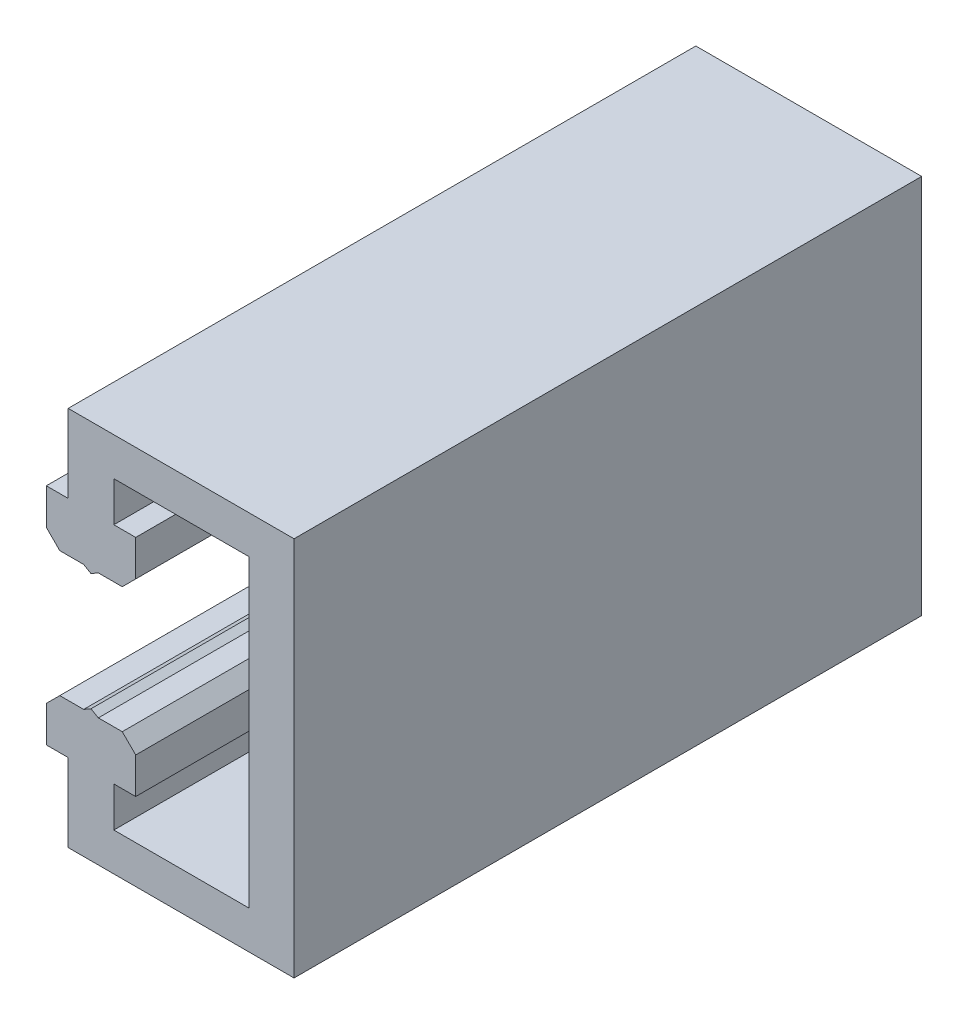
ISO-10303-21;
HEADER;
FILE_DESCRIPTION(('STEP AP214'),'2;1');
FILE_NAME('part.step','',(''),(''),'','','');
FILE_SCHEMA(('AUTOMOTIVE_DESIGN { 1 0 10303 214 1 1 1 1 }'));
ENDSEC;
DATA;
#1=APPLICATION_CONTEXT('core data for automotive mechanical design processes');
#2=APPLICATION_PROTOCOL_DEFINITION('international standard','automotive_design',2000,#1);
#3=PRODUCT_CONTEXT('',#1,'mechanical');
#4=PRODUCT('Part','Part','',(#3));
#5=PRODUCT_RELATED_PRODUCT_CATEGORY('part','',(#4));
#6=PRODUCT_DEFINITION_FORMATION('','',#4);
#7=PRODUCT_DEFINITION_CONTEXT('part definition',#1,'design');
#8=PRODUCT_DEFINITION('design','',#6,#7);
#9=PRODUCT_DEFINITION_SHAPE('','',#8);
#10=(LENGTH_UNIT() NAMED_UNIT(*) SI_UNIT(.MILLI.,.METRE.));
#11=(NAMED_UNIT(*) PLANE_ANGLE_UNIT() SI_UNIT($,.RADIAN.));
#12=(NAMED_UNIT(*) SI_UNIT($,.STERADIAN.) SOLID_ANGLE_UNIT());
#13=UNCERTAINTY_MEASURE_WITH_UNIT(LENGTH_MEASURE(1.E-05),#10,'distance_accuracy_value','');
#14=(GEOMETRIC_REPRESENTATION_CONTEXT(3) GLOBAL_UNCERTAINTY_ASSIGNED_CONTEXT((#13)) GLOBAL_UNIT_ASSIGNED_CONTEXT((#10,
#11,#12)) REPRESENTATION_CONTEXT('',''));
#15=CARTESIAN_POINT('',(0.,0.,0.));
#16=DIRECTION('',(0.,0.,1.));
#17=DIRECTION('',(1.,0.,0.));
#18=AXIS2_PLACEMENT_3D('',#15,#16,#17);
#19=CARTESIAN_POINT('',(1253.63302230835,549.842417240143,33.));
#20=DIRECTION('',(1.,0.,0.));
#21=DIRECTION('',(0.,0.,-1.));
#22=AXIS2_PLACEMENT_3D('',#19,#20,#21);
#23=PLANE('',#22);
#24=DIRECTION('',(0.,-1.,0.));
#25=VECTOR('',#24,1.);
#26=CARTESIAN_POINT('',(1253.63302230835,549.842417240143,0.));
#27=LINE('',#26,#25);
#28=CARTESIAN_POINT('',(1253.63302230835,553.942382335663,0.));
#29=VERTEX_POINT('',#28);
#30=CARTESIAN_POINT('',(1253.63302230835,549.842417240143,0.));
#31=VERTEX_POINT('',#30);
#32=EDGE_CURVE('E261',#29,#31,#27,.T.);
#33=ORIENTED_EDGE('',*,*,#32,.T.);
#34=DIRECTION('',(0.,0.,-1.));
#35=VECTOR('',#34,1.);
#36=CARTESIAN_POINT('',(1253.63302230835,549.842417240143,33.));
#37=LINE('',#36,#35);
#38=CARTESIAN_POINT('',(1253.63302230835,549.842417240143,33.));
#39=VERTEX_POINT('',#38);
#40=EDGE_CURVE('E11',#39,#31,#37,.T.);
#41=ORIENTED_EDGE('',*,*,#40,.F.);
#42=DIRECTION('',(0.,-1.,0.));
#43=VECTOR('',#42,1.);
#44=CARTESIAN_POINT('',(1253.63302230835,549.842417240143,33.));
#45=LINE('',#44,#43);
#46=CARTESIAN_POINT('',(1253.63302230835,553.942382335663,33.));
#47=VERTEX_POINT('',#46);
#48=EDGE_CURVE('E319',#47,#39,#45,.T.);
#49=ORIENTED_EDGE('',*,*,#48,.F.);
#50=DIRECTION('',(0.,0.,-1.));
#51=VECTOR('',#50,1.);
#52=CARTESIAN_POINT('',(1253.63302230835,553.942382335663,33.));
#53=LINE('',#52,#51);
#54=EDGE_CURVE('E257',#47,#29,#53,.T.);
#55=ORIENTED_EDGE('',*,*,#54,.T.);
#56=EDGE_LOOP('',(#33,#41,#49,#55));
#57=FACE_BOUND('',#56,.T.);
#58=ADVANCED_FACE('F33',(#57),#23,.F.);
#59=CARTESIAN_POINT('',(1252.48301029205,549.842417240143,33.));
#60=DIRECTION('',(0.,-1.,0.));
#61=DIRECTION('',(0.,0.,-1.));
#62=AXIS2_PLACEMENT_3D('',#59,#60,#61);
#63=PLANE('',#62);
#64=DIRECTION('',(-1.,0.,0.));
#65=VECTOR('',#64,1.);
#66=CARTESIAN_POINT('',(1252.48301029205,549.842417240143,0.));
#67=LINE('',#66,#65);
#68=CARTESIAN_POINT('',(1252.48301029205,549.842417240143,0.));
#69=VERTEX_POINT('',#68);
#70=EDGE_CURVE('E264',#31,#69,#67,.T.);
#71=ORIENTED_EDGE('',*,*,#70,.T.);
#72=DIRECTION('',(0.,0.,-1.));
#73=VECTOR('',#72,1.);
#74=CARTESIAN_POINT('',(1252.48301029205,549.842417240143,33.));
#75=LINE('',#74,#73);
#76=CARTESIAN_POINT('',(1252.48301029205,549.842417240143,33.));
#77=VERTEX_POINT('',#76);
#78=EDGE_CURVE('E41',#77,#69,#75,.T.);
#79=ORIENTED_EDGE('',*,*,#78,.F.);
#80=DIRECTION('',(-1.,0.,0.));
#81=VECTOR('',#80,1.);
#82=CARTESIAN_POINT('',(1252.48301029205,549.842417240143,33.));
#83=LINE('',#82,#81);
#84=EDGE_CURVE('E158',#39,#77,#83,.T.);
#85=ORIENTED_EDGE('',*,*,#84,.F.);
#86=ORIENTED_EDGE('',*,*,#40,.T.);
#87=EDGE_LOOP('',(#71,#79,#85,#86));
#88=FACE_BOUND('',#87,.T.);
#89=ADVANCED_FACE('F487',(#88),#63,.F.);
#90=CARTESIAN_POINT('',(1252.48301029205,547.949492931366,33.));
#91=DIRECTION('',(1.,0.,0.));
#92=DIRECTION('',(0.,0.,-1.));
#93=AXIS2_PLACEMENT_3D('',#90,#91,#92);
#94=PLANE('',#93);
#95=DIRECTION('',(0.,-1.,0.));
#96=VECTOR('',#95,1.);
#97=CARTESIAN_POINT('',(1252.48301029205,547.949492931366,0.));
#98=LINE('',#97,#96);
#99=CARTESIAN_POINT('',(1252.48301029205,547.949492931366,0.));
#100=VERTEX_POINT('',#99);
#101=EDGE_CURVE('E266',#69,#100,#98,.T.);
#102=ORIENTED_EDGE('',*,*,#101,.T.);
#103=DIRECTION('',(0.,0.,-1.));
#104=VECTOR('',#103,1.);
#105=CARTESIAN_POINT('',(1252.48301029205,547.949492931366,33.));
#106=LINE('',#105,#104);
#107=CARTESIAN_POINT('',(1252.48301029205,547.949492931366,33.));
#108=VERTEX_POINT('',#107);
#109=EDGE_CURVE('E392',#108,#100,#106,.T.);
#110=ORIENTED_EDGE('',*,*,#109,.F.);
#111=DIRECTION('',(0.,-1.,0.));
#112=VECTOR('',#111,1.);
#113=CARTESIAN_POINT('',(1252.48301029205,547.949492931366,33.));
#114=LINE('',#113,#112);
#115=EDGE_CURVE('E400',#77,#108,#114,.T.);
#116=ORIENTED_EDGE('',*,*,#115,.F.);
#117=ORIENTED_EDGE('',*,*,#78,.T.);
#118=EDGE_LOOP('',(#102,#110,#116,#117));
#119=FACE_BOUND('',#118,.T.);
#120=ADVANCED_FACE('F398',(#119),#94,.F.);
#121=CARTESIAN_POINT('',(1253.19015979767,547.242403030396,33.));
#122=DIRECTION('',(0.707076978780788,0.707136582336279,0.));
#123=DIRECTION('',(-0.707136582336279,0.707076978780788,0.));
#124=AXIS2_PLACEMENT_3D('',#121,#122,#123);
#125=PLANE('',#124);
#126=DIRECTION('',(0.707136582336279,-0.707076978780788,0.));
#127=VECTOR('',#126,1.);
#128=CARTESIAN_POINT('',(1253.19015979767,547.242403030396,0.));
#129=LINE('',#128,#127);
#130=CARTESIAN_POINT('',(1253.19015979767,547.242403030396,0.));
#131=VERTEX_POINT('',#130);
#132=EDGE_CURVE('E268',#100,#131,#129,.T.);
#133=ORIENTED_EDGE('',*,*,#132,.T.);
#134=DIRECTION('',(0.,0.,-1.));
#135=VECTOR('',#134,1.);
#136=CARTESIAN_POINT('',(1253.19015979767,547.242403030396,33.));
#137=LINE('',#136,#135);
#138=CARTESIAN_POINT('',(1253.19015979767,547.242403030396,33.));
#139=VERTEX_POINT('',#138);
#140=EDGE_CURVE('E389',#139,#131,#137,.T.);
#141=ORIENTED_EDGE('',*,*,#140,.F.);
#142=DIRECTION('',(0.707136582336279,-0.707076978780788,0.));
#143=VECTOR('',#142,1.);
#144=CARTESIAN_POINT('',(1253.19015979767,547.242403030396,33.));
#145=LINE('',#144,#143);
#146=EDGE_CURVE('E418',#108,#139,#145,.T.);
#147=ORIENTED_EDGE('',*,*,#146,.F.);
#148=ORIENTED_EDGE('',*,*,#109,.T.);
#149=EDGE_LOOP('',(#133,#141,#147,#148));
#150=FACE_BOUND('',#149,.T.);
#151=ADVANCED_FACE('F409',(#150),#125,.F.);
#152=CARTESIAN_POINT('',(1254.44746017456,547.242403030396,33.));
#153=DIRECTION('',(0.,1.,0.));
#154=DIRECTION('',(0.,0.,1.));
#155=AXIS2_PLACEMENT_3D('',#152,#153,#154);
#156=PLANE('',#155);
#157=DIRECTION('',(1.,0.,0.));
#158=VECTOR('',#157,1.);
#159=CARTESIAN_POINT('',(1254.44746017456,547.242403030396,0.));
#160=LINE('',#159,#158);
#161=CARTESIAN_POINT('',(1254.44746017456,547.242403030396,0.));
#162=VERTEX_POINT('',#161);
#163=EDGE_CURVE('E270',#131,#162,#160,.T.);
#164=ORIENTED_EDGE('',*,*,#163,.T.);
#165=DIRECTION('',(0.,0.,-1.));
#166=VECTOR('',#165,1.);
#167=CARTESIAN_POINT('',(1254.44746017456,547.242403030396,33.));
#168=LINE('',#167,#166);
#169=CARTESIAN_POINT('',(1254.44746017456,547.242403030396,33.));
#170=VERTEX_POINT('',#169);
#171=EDGE_CURVE('E386',#170,#162,#168,.T.);
#172=ORIENTED_EDGE('',*,*,#171,.F.);
#173=DIRECTION('',(1.,0.,0.));
#174=VECTOR('',#173,1.);
#175=CARTESIAN_POINT('',(1254.44746017456,547.242403030396,33.));
#176=LINE('',#175,#174);
#177=EDGE_CURVE('E415',#139,#170,#176,.T.);
#178=ORIENTED_EDGE('',*,*,#177,.F.);
#179=ORIENTED_EDGE('',*,*,#140,.T.);
#180=EDGE_LOOP('',(#164,#172,#178,#179));
#181=FACE_BOUND('',#180,.T.);
#182=ADVANCED_FACE('F413',(#181),#156,.F.);
#183=CARTESIAN_POINT('',(1254.83310222626,547.019720077515,33.));
#184=DIRECTION('',(0.500054584563358,0.865993887078406,0.));
#185=DIRECTION('',(-0.865993887078406,0.500054584563358,0.));
#186=AXIS2_PLACEMENT_3D('',#183,#184,#185);
#187=PLANE('',#186);
#188=DIRECTION('',(0.865993887078406,-0.500054584563358,0.));
#189=VECTOR('',#188,1.);
#190=CARTESIAN_POINT('',(1254.83310222626,547.019720077515,0.));
#191=LINE('',#190,#189);
#192=CARTESIAN_POINT('',(1254.83310222626,547.019720077515,0.));
#193=VERTEX_POINT('',#192);
#194=EDGE_CURVE('E272',#162,#193,#191,.T.);
#195=ORIENTED_EDGE('',*,*,#194,.T.);
#196=DIRECTION('',(0.,0.,-1.));
#197=VECTOR('',#196,1.);
#198=CARTESIAN_POINT('',(1254.83310222626,547.019720077515,33.));
#199=LINE('',#198,#197);
#200=CARTESIAN_POINT('',(1254.83310222626,547.019720077515,33.));
#201=VERTEX_POINT('',#200);
#202=EDGE_CURVE('E383',#201,#193,#199,.T.);
#203=ORIENTED_EDGE('',*,*,#202,.F.);
#204=DIRECTION('',(0.865993887078406,-0.500054584563358,0.));
#205=VECTOR('',#204,1.);
#206=CARTESIAN_POINT('',(1254.83310222626,547.019720077515,33.));
#207=LINE('',#206,#205);
#208=EDGE_CURVE('E417',#170,#201,#207,.T.);
#209=ORIENTED_EDGE('',*,*,#208,.F.);
#210=ORIENTED_EDGE('',*,*,#171,.T.);
#211=EDGE_LOOP('',(#195,#203,#209,#210));
#212=FACE_BOUND('',#211,.T.);
#213=ADVANCED_FACE('F500',(#212),#187,.F.);
#214=CARTESIAN_POINT('',(1255.21874427795,547.242403030396,33.));
#215=DIRECTION('',(-0.500054584563358,0.865993887078406,0.));
#216=DIRECTION('',(-0.865993887078406,-0.500054584563358,0.));
#217=AXIS2_PLACEMENT_3D('',#214,#215,#216);
#218=PLANE('',#217);
#219=DIRECTION('',(0.865993887078406,0.500054584563358,0.));
#220=VECTOR('',#219,1.);
#221=CARTESIAN_POINT('',(1255.21874427795,547.242403030396,0.));
#222=LINE('',#221,#220);
#223=CARTESIAN_POINT('',(1255.21874427795,547.242403030396,0.));
#224=VERTEX_POINT('',#223);
#225=EDGE_CURVE('E274',#193,#224,#222,.T.);
#226=ORIENTED_EDGE('',*,*,#225,.T.);
#227=DIRECTION('',(0.,0.,-1.));
#228=VECTOR('',#227,1.);
#229=CARTESIAN_POINT('',(1255.21874427795,547.242403030396,33.));
#230=LINE('',#229,#228);
#231=CARTESIAN_POINT('',(1255.21874427795,547.242403030396,33.));
#232=VERTEX_POINT('',#231);
#233=EDGE_CURVE('E380',#232,#224,#230,.T.);
#234=ORIENTED_EDGE('',*,*,#233,.F.);
#235=DIRECTION('',(0.865993887078406,0.500054584563358,0.));
#236=VECTOR('',#235,1.);
#237=CARTESIAN_POINT('',(1255.21874427795,547.242403030396,33.));
#238=LINE('',#237,#236);
#239=EDGE_CURVE('E420',#201,#232,#238,.T.);
#240=ORIENTED_EDGE('',*,*,#239,.F.);
#241=ORIENTED_EDGE('',*,*,#202,.T.);
#242=EDGE_LOOP('',(#226,#234,#240,#241));
#243=FACE_BOUND('',#242,.T.);
#244=ADVANCED_FACE('F503',(#243),#218,.F.);
#245=CARTESIAN_POINT('',(1256.47592544556,547.242403030396,33.));
#246=DIRECTION('',(0.,1.,0.));
#247=DIRECTION('',(0.,0.,1.));
#248=AXIS2_PLACEMENT_3D('',#245,#246,#247);
#249=PLANE('',#248);
#250=DIRECTION('',(1.,0.,0.));
#251=VECTOR('',#250,1.);
#252=CARTESIAN_POINT('',(1256.47592544556,547.242403030396,0.));
#253=LINE('',#252,#251);
#254=CARTESIAN_POINT('',(1256.47592544556,547.242403030396,0.));
#255=VERTEX_POINT('',#254);
#256=EDGE_CURVE('E276',#224,#255,#253,.T.);
#257=ORIENTED_EDGE('',*,*,#256,.T.);
#258=DIRECTION('',(0.,0.,-1.));
#259=VECTOR('',#258,1.);
#260=CARTESIAN_POINT('',(1256.47592544556,547.242403030396,33.));
#261=LINE('',#260,#259);
#262=CARTESIAN_POINT('',(1256.47592544556,547.242403030396,33.));
#263=VERTEX_POINT('',#262);
#264=EDGE_CURVE('E377',#263,#255,#261,.T.);
#265=ORIENTED_EDGE('',*,*,#264,.F.);
#266=DIRECTION('',(1.,0.,0.));
#267=VECTOR('',#266,1.);
#268=CARTESIAN_POINT('',(1256.47592544556,547.242403030396,33.));
#269=LINE('',#268,#267);
#270=EDGE_CURVE('E426',#232,#263,#269,.T.);
#271=ORIENTED_EDGE('',*,*,#270,.F.);
#272=ORIENTED_EDGE('',*,*,#233,.T.);
#273=EDGE_LOOP('',(#257,#265,#271,#272));
#274=FACE_BOUND('',#273,.T.);
#275=ADVANCED_FACE('F507',(#274),#249,.F.);
#276=CARTESIAN_POINT('',(1257.18307495117,547.949492931366,33.));
#277=DIRECTION('',(-0.707076978780788,0.707136582336279,0.));
#278=DIRECTION('',(-0.707136582336279,-0.707076978780788,0.));
#279=AXIS2_PLACEMENT_3D('',#276,#277,#278);
#280=PLANE('',#279);
#281=DIRECTION('',(0.707136582336279,0.707076978780788,0.));
#282=VECTOR('',#281,1.);
#283=CARTESIAN_POINT('',(1257.18307495117,547.949492931366,0.));
#284=LINE('',#283,#282);
#285=CARTESIAN_POINT('',(1257.18307495117,547.949492931366,0.));
#286=VERTEX_POINT('',#285);
#287=EDGE_CURVE('E278',#255,#286,#284,.T.);
#288=ORIENTED_EDGE('',*,*,#287,.T.);
#289=DIRECTION('',(0.,0.,-1.));
#290=VECTOR('',#289,1.);
#291=CARTESIAN_POINT('',(1257.18307495117,547.949492931366,33.));
#292=LINE('',#291,#290);
#293=CARTESIAN_POINT('',(1257.18307495117,547.949492931366,33.));
#294=VERTEX_POINT('',#293);
#295=EDGE_CURVE('E374',#294,#286,#292,.T.);
#296=ORIENTED_EDGE('',*,*,#295,.F.);
#297=DIRECTION('',(0.707136582336279,0.707076978780788,0.));
#298=VECTOR('',#297,1.);
#299=CARTESIAN_POINT('',(1257.18307495117,547.949492931366,33.));
#300=LINE('',#299,#298);
#301=EDGE_CURVE('E428',#263,#294,#300,.T.);
#302=ORIENTED_EDGE('',*,*,#301,.F.);
#303=ORIENTED_EDGE('',*,*,#264,.T.);
#304=EDGE_LOOP('',(#288,#296,#302,#303));
#305=FACE_BOUND('',#304,.T.);
#306=ADVANCED_FACE('F511',(#305),#280,.F.);
#307=CARTESIAN_POINT('',(1257.18307495117,549.842417240143,33.));
#308=DIRECTION('',(-1.,0.,0.));
#309=DIRECTION('',(0.,0.,1.));
#310=AXIS2_PLACEMENT_3D('',#307,#308,#309);
#311=PLANE('',#310);
#312=DIRECTION('',(0.,1.,0.));
#313=VECTOR('',#312,1.);
#314=CARTESIAN_POINT('',(1257.18307495117,549.842417240143,0.));
#315=LINE('',#314,#313);
#316=CARTESIAN_POINT('',(1257.18307495117,549.842417240143,0.));
#317=VERTEX_POINT('',#316);
#318=EDGE_CURVE('E280',#286,#317,#315,.T.);
#319=ORIENTED_EDGE('',*,*,#318,.T.);
#320=DIRECTION('',(0.,0.,-1.));
#321=VECTOR('',#320,1.);
#322=CARTESIAN_POINT('',(1257.18307495117,549.842417240143,33.));
#323=LINE('',#322,#321);
#324=CARTESIAN_POINT('',(1257.18307495117,549.842417240143,33.));
#325=VERTEX_POINT('',#324);
#326=EDGE_CURVE('E371',#325,#317,#323,.T.);
#327=ORIENTED_EDGE('',*,*,#326,.F.);
#328=DIRECTION('',(0.,1.,0.));
#329=VECTOR('',#328,1.);
#330=CARTESIAN_POINT('',(1257.18307495117,549.842417240143,33.));
#331=LINE('',#330,#329);
#332=EDGE_CURVE('E430',#294,#325,#331,.T.);
#333=ORIENTED_EDGE('',*,*,#332,.F.);
#334=ORIENTED_EDGE('',*,*,#295,.T.);
#335=EDGE_LOOP('',(#319,#327,#333,#334));
#336=FACE_BOUND('',#335,.T.);
#337=ADVANCED_FACE('F515',(#336),#311,.F.);
#338=CARTESIAN_POINT('',(1256.03306293488,549.842417240143,33.));
#339=DIRECTION('',(0.,-1.,0.));
#340=DIRECTION('',(0.,0.,-1.));
#341=AXIS2_PLACEMENT_3D('',#338,#339,#340);
#342=PLANE('',#341);
#343=DIRECTION('',(-1.,0.,0.));
#344=VECTOR('',#343,1.);
#345=CARTESIAN_POINT('',(1256.03306293488,549.842417240143,0.));
#346=LINE('',#345,#344);
#347=CARTESIAN_POINT('',(1256.03306293488,549.842417240143,0.));
#348=VERTEX_POINT('',#347);
#349=EDGE_CURVE('E282',#317,#348,#346,.T.);
#350=ORIENTED_EDGE('',*,*,#349,.T.);
#351=DIRECTION('',(0.,0.,-1.));
#352=VECTOR('',#351,1.);
#353=CARTESIAN_POINT('',(1256.03306293488,549.842417240143,33.));
#354=LINE('',#353,#352);
#355=CARTESIAN_POINT('',(1256.03306293488,549.842417240143,33.));
#356=VERTEX_POINT('',#355);
#357=EDGE_CURVE('E368',#356,#348,#354,.T.);
#358=ORIENTED_EDGE('',*,*,#357,.F.);
#359=DIRECTION('',(-1.,0.,0.));
#360=VECTOR('',#359,1.);
#361=CARTESIAN_POINT('',(1256.03306293488,549.842417240143,33.));
#362=LINE('',#361,#360);
#363=EDGE_CURVE('E432',#325,#356,#362,.T.);
#364=ORIENTED_EDGE('',*,*,#363,.F.);
#365=ORIENTED_EDGE('',*,*,#326,.T.);
#366=EDGE_LOOP('',(#350,#358,#364,#365));
#367=FACE_BOUND('',#366,.T.);
#368=ADVANCED_FACE('F519',(#367),#342,.F.);
#369=CARTESIAN_POINT('',(1256.03306293488,551.942408084869,33.));
#370=DIRECTION('',(-1.,0.,0.));
#371=DIRECTION('',(0.,0.,1.));
#372=AXIS2_PLACEMENT_3D('',#369,#370,#371);
#373=PLANE('',#372);
#374=DIRECTION('',(0.,1.,0.));
#375=VECTOR('',#374,1.);
#376=CARTESIAN_POINT('',(1256.03306293488,551.942408084869,0.));
#377=LINE('',#376,#375);
#378=CARTESIAN_POINT('',(1256.03306293488,551.942408084869,0.));
#379=VERTEX_POINT('',#378);
#380=EDGE_CURVE('E284',#348,#379,#377,.T.);
#381=ORIENTED_EDGE('',*,*,#380,.T.);
#382=DIRECTION('',(0.,0.,-1.));
#383=VECTOR('',#382,1.);
#384=CARTESIAN_POINT('',(1256.03306293488,551.942408084869,33.));
#385=LINE('',#384,#383);
#386=CARTESIAN_POINT('',(1256.03306293488,551.942408084869,33.));
#387=VERTEX_POINT('',#386);
#388=EDGE_CURVE('E365',#387,#379,#385,.T.);
#389=ORIENTED_EDGE('',*,*,#388,.F.);
#390=DIRECTION('',(0.,1.,0.));
#391=VECTOR('',#390,1.);
#392=CARTESIAN_POINT('',(1256.03306293488,551.942408084869,33.));
#393=LINE('',#392,#391);
#394=EDGE_CURVE('E434',#356,#387,#393,.T.);
#395=ORIENTED_EDGE('',*,*,#394,.F.);
#396=ORIENTED_EDGE('',*,*,#357,.T.);
#397=EDGE_LOOP('',(#381,#389,#395,#396));
#398=FACE_BOUND('',#397,.T.);
#399=ADVANCED_FACE('F523',(#398),#373,.F.);
#400=CARTESIAN_POINT('',(1263.12685012817,551.942408084869,33.));
#401=DIRECTION('',(0.,1.,0.));
#402=DIRECTION('',(0.,0.,1.));
#403=AXIS2_PLACEMENT_3D('',#400,#401,#402);
#404=PLANE('',#403);
#405=DIRECTION('',(1.,0.,0.));
#406=VECTOR('',#405,1.);
#407=CARTESIAN_POINT('',(1263.12685012817,551.942408084869,0.));
#408=LINE('',#407,#406);
#409=CARTESIAN_POINT('',(1263.12685012817,551.942408084869,0.));
#410=VERTEX_POINT('',#409);
#411=EDGE_CURVE('E286',#379,#410,#408,.T.);
#412=ORIENTED_EDGE('',*,*,#411,.T.);
#413=DIRECTION('',(0.,0.,-1.));
#414=VECTOR('',#413,1.);
#415=CARTESIAN_POINT('',(1263.12685012817,551.942408084869,33.));
#416=LINE('',#415,#414);
#417=CARTESIAN_POINT('',(1263.12685012817,551.942408084869,33.));
#418=VERTEX_POINT('',#417);
#419=EDGE_CURVE('E362',#418,#410,#416,.T.);
#420=ORIENTED_EDGE('',*,*,#419,.F.);
#421=DIRECTION('',(1.,0.,0.));
#422=VECTOR('',#421,1.);
#423=CARTESIAN_POINT('',(1263.12685012817,551.942408084869,33.));
#424=LINE('',#423,#422);
#425=EDGE_CURVE('E436',#387,#418,#424,.T.);
#426=ORIENTED_EDGE('',*,*,#425,.F.);
#427=ORIENTED_EDGE('',*,*,#388,.T.);
#428=EDGE_LOOP('',(#412,#420,#426,#427));
#429=FACE_BOUND('',#428,.T.);
#430=ADVANCED_FACE('F527',(#429),#404,.F.);
#431=CARTESIAN_POINT('',(1263.12685012817,535.942375659943,33.));
#432=DIRECTION('',(1.,0.,0.));
#433=DIRECTION('',(0.,0.,-1.));
#434=AXIS2_PLACEMENT_3D('',#431,#432,#433);
#435=PLANE('',#434);
#436=DIRECTION('',(0.,-1.,0.));
#437=VECTOR('',#436,1.);
#438=CARTESIAN_POINT('',(1263.12685012817,535.942375659943,0.));
#439=LINE('',#438,#437);
#440=CARTESIAN_POINT('',(1263.12685012817,535.942375659943,0.));
#441=VERTEX_POINT('',#440);
#442=EDGE_CURVE('E288',#410,#441,#439,.T.);
#443=ORIENTED_EDGE('',*,*,#442,.T.);
#444=DIRECTION('',(0.,0.,-1.));
#445=VECTOR('',#444,1.);
#446=CARTESIAN_POINT('',(1263.12685012817,535.942375659943,33.));
#447=LINE('',#446,#445);
#448=CARTESIAN_POINT('',(1263.12685012817,535.942375659943,33.));
#449=VERTEX_POINT('',#448);
#450=EDGE_CURVE('E359',#449,#441,#447,.T.);
#451=ORIENTED_EDGE('',*,*,#450,.F.);
#452=DIRECTION('',(0.,-1.,0.));
#453=VECTOR('',#452,1.);
#454=CARTESIAN_POINT('',(1263.12685012817,535.942375659943,33.));
#455=LINE('',#454,#453);
#456=EDGE_CURVE('E438',#418,#449,#455,.T.);
#457=ORIENTED_EDGE('',*,*,#456,.F.);
#458=ORIENTED_EDGE('',*,*,#419,.T.);
#459=EDGE_LOOP('',(#443,#451,#457,#458));
#460=FACE_BOUND('',#459,.T.);
#461=ADVANCED_FACE('F531',(#460),#435,.F.);
#462=CARTESIAN_POINT('',(1256.03306293488,535.942375659943,33.));
#463=DIRECTION('',(0.,-1.,0.));
#464=DIRECTION('',(0.,0.,-1.));
#465=AXIS2_PLACEMENT_3D('',#462,#463,#464);
#466=PLANE('',#465);
#467=DIRECTION('',(-1.,0.,0.));
#468=VECTOR('',#467,1.);
#469=CARTESIAN_POINT('',(1256.03306293488,535.942375659943,0.));
#470=LINE('',#469,#468);
#471=CARTESIAN_POINT('',(1256.03306293488,535.942375659943,0.));
#472=VERTEX_POINT('',#471);
#473=EDGE_CURVE('E290',#441,#472,#470,.T.);
#474=ORIENTED_EDGE('',*,*,#473,.T.);
#475=DIRECTION('',(0.,0.,-1.));
#476=VECTOR('',#475,1.);
#477=CARTESIAN_POINT('',(1256.03306293488,535.942375659943,33.));
#478=LINE('',#477,#476);
#479=CARTESIAN_POINT('',(1256.03306293488,535.942375659943,33.));
#480=VERTEX_POINT('',#479);
#481=EDGE_CURVE('E356',#480,#472,#478,.T.);
#482=ORIENTED_EDGE('',*,*,#481,.F.);
#483=DIRECTION('',(-1.,0.,0.));
#484=VECTOR('',#483,1.);
#485=CARTESIAN_POINT('',(1256.03306293488,535.942375659943,33.));
#486=LINE('',#485,#484);
#487=EDGE_CURVE('E440',#449,#480,#486,.T.);
#488=ORIENTED_EDGE('',*,*,#487,.F.);
#489=ORIENTED_EDGE('',*,*,#450,.T.);
#490=EDGE_LOOP('',(#474,#482,#488,#489));
#491=FACE_BOUND('',#490,.T.);
#492=ADVANCED_FACE('F535',(#491),#466,.F.);
#493=CARTESIAN_POINT('',(1256.03306293488,538.042366504669,33.));
#494=DIRECTION('',(-1.,0.,0.));
#495=DIRECTION('',(0.,0.,1.));
#496=AXIS2_PLACEMENT_3D('',#493,#494,#495);
#497=PLANE('',#496);
#498=DIRECTION('',(0.,1.,0.));
#499=VECTOR('',#498,1.);
#500=CARTESIAN_POINT('',(1256.03306293488,538.042366504669,0.));
#501=LINE('',#500,#499);
#502=CARTESIAN_POINT('',(1256.03306293488,538.042366504669,0.));
#503=VERTEX_POINT('',#502);
#504=EDGE_CURVE('E292',#472,#503,#501,.T.);
#505=ORIENTED_EDGE('',*,*,#504,.T.);
#506=DIRECTION('',(0.,0.,-1.));
#507=VECTOR('',#506,1.);
#508=CARTESIAN_POINT('',(1256.03306293488,538.042366504669,33.));
#509=LINE('',#508,#507);
#510=CARTESIAN_POINT('',(1256.03306293488,538.042366504669,33.));
#511=VERTEX_POINT('',#510);
#512=EDGE_CURVE('E353',#511,#503,#509,.T.);
#513=ORIENTED_EDGE('',*,*,#512,.F.);
#514=DIRECTION('',(0.,1.,0.));
#515=VECTOR('',#514,1.);
#516=CARTESIAN_POINT('',(1256.03306293488,538.042366504669,33.));
#517=LINE('',#516,#515);
#518=EDGE_CURVE('E442',#480,#511,#517,.T.);
#519=ORIENTED_EDGE('',*,*,#518,.F.);
#520=ORIENTED_EDGE('',*,*,#481,.T.);
#521=EDGE_LOOP('',(#505,#513,#519,#520));
#522=FACE_BOUND('',#521,.T.);
#523=ADVANCED_FACE('F539',(#522),#497,.F.);
#524=CARTESIAN_POINT('',(1257.18307495117,538.042366504669,33.));
#525=DIRECTION('',(0.,1.,0.));
#526=DIRECTION('',(0.,0.,1.));
#527=AXIS2_PLACEMENT_3D('',#524,#525,#526);
#528=PLANE('',#527);
#529=DIRECTION('',(1.,0.,0.));
#530=VECTOR('',#529,1.);
#531=CARTESIAN_POINT('',(1257.18307495117,538.042366504669,0.));
#532=LINE('',#531,#530);
#533=CARTESIAN_POINT('',(1257.18307495117,538.042366504669,0.));
#534=VERTEX_POINT('',#533);
#535=EDGE_CURVE('E294',#503,#534,#532,.T.);
#536=ORIENTED_EDGE('',*,*,#535,.T.);
#537=DIRECTION('',(0.,0.,-1.));
#538=VECTOR('',#537,1.);
#539=CARTESIAN_POINT('',(1257.18307495117,538.042366504669,33.));
#540=LINE('',#539,#538);
#541=CARTESIAN_POINT('',(1257.18307495117,538.042366504669,33.));
#542=VERTEX_POINT('',#541);
#543=EDGE_CURVE('E350',#542,#534,#540,.T.);
#544=ORIENTED_EDGE('',*,*,#543,.F.);
#545=DIRECTION('',(1.,0.,0.));
#546=VECTOR('',#545,1.);
#547=CARTESIAN_POINT('',(1257.18307495117,538.042366504669,33.));
#548=LINE('',#547,#546);
#549=EDGE_CURVE('E444',#511,#542,#548,.T.);
#550=ORIENTED_EDGE('',*,*,#549,.F.);
#551=ORIENTED_EDGE('',*,*,#512,.T.);
#552=EDGE_LOOP('',(#536,#544,#550,#551));
#553=FACE_BOUND('',#552,.T.);
#554=ADVANCED_FACE('F543',(#553),#528,.F.);
#555=CARTESIAN_POINT('',(1257.18307495117,539.935290813446,33.));
#556=DIRECTION('',(-1.,0.,0.));
#557=DIRECTION('',(0.,0.,1.));
#558=AXIS2_PLACEMENT_3D('',#555,#556,#557);
#559=PLANE('',#558);
#560=DIRECTION('',(0.,1.,0.));
#561=VECTOR('',#560,1.);
#562=CARTESIAN_POINT('',(1257.18307495117,539.935290813446,0.));
#563=LINE('',#562,#561);
#564=CARTESIAN_POINT('',(1257.18307495117,539.935290813446,0.));
#565=VERTEX_POINT('',#564);
#566=EDGE_CURVE('E296',#534,#565,#563,.T.);
#567=ORIENTED_EDGE('',*,*,#566,.T.);
#568=DIRECTION('',(0.,0.,-1.));
#569=VECTOR('',#568,1.);
#570=CARTESIAN_POINT('',(1257.18307495117,539.935290813446,33.));
#571=LINE('',#570,#569);
#572=CARTESIAN_POINT('',(1257.18307495117,539.935290813446,33.));
#573=VERTEX_POINT('',#572);
#574=EDGE_CURVE('E347',#573,#565,#571,.T.);
#575=ORIENTED_EDGE('',*,*,#574,.F.);
#576=DIRECTION('',(0.,1.,0.));
#577=VECTOR('',#576,1.);
#578=CARTESIAN_POINT('',(1257.18307495117,539.935290813446,33.));
#579=LINE('',#578,#577);
#580=EDGE_CURVE('E446',#542,#573,#579,.T.);
#581=ORIENTED_EDGE('',*,*,#580,.F.);
#582=ORIENTED_EDGE('',*,*,#543,.T.);
#583=EDGE_LOOP('',(#567,#575,#581,#582));
#584=FACE_BOUND('',#583,.T.);
#585=ADVANCED_FACE('F547',(#584),#559,.F.);
#586=CARTESIAN_POINT('',(1256.47592544556,540.642380714417,33.));
#587=DIRECTION('',(-0.707076978780788,-0.707136582336279,0.));
#588=DIRECTION('',(0.707136582336279,-0.707076978780788,0.));
#589=AXIS2_PLACEMENT_3D('',#586,#587,#588);
#590=PLANE('',#589);
#591=DIRECTION('',(-0.707136582336279,0.707076978780788,0.));
#592=VECTOR('',#591,1.);
#593=CARTESIAN_POINT('',(1256.47592544556,540.642380714417,0.));
#594=LINE('',#593,#592);
#595=CARTESIAN_POINT('',(1256.47592544556,540.642380714417,0.));
#596=VERTEX_POINT('',#595);
#597=EDGE_CURVE('E298',#565,#596,#594,.T.);
#598=ORIENTED_EDGE('',*,*,#597,.T.);
#599=DIRECTION('',(0.,0.,-1.));
#600=VECTOR('',#599,1.);
#601=CARTESIAN_POINT('',(1256.47592544556,540.642380714417,33.));
#602=LINE('',#601,#600);
#603=CARTESIAN_POINT('',(1256.47592544556,540.642380714417,33.));
#604=VERTEX_POINT('',#603);
#605=EDGE_CURVE('E344',#604,#596,#602,.T.);
#606=ORIENTED_EDGE('',*,*,#605,.F.);
#607=DIRECTION('',(-0.707136582336279,0.707076978780788,0.));
#608=VECTOR('',#607,1.);
#609=CARTESIAN_POINT('',(1256.47592544556,540.642380714417,33.));
#610=LINE('',#609,#608);
#611=EDGE_CURVE('E448',#573,#604,#610,.T.);
#612=ORIENTED_EDGE('',*,*,#611,.F.);
#613=ORIENTED_EDGE('',*,*,#574,.T.);
#614=EDGE_LOOP('',(#598,#606,#612,#613));
#615=FACE_BOUND('',#614,.T.);
#616=ADVANCED_FACE('F551',(#615),#590,.F.);
#617=CARTESIAN_POINT('',(1255.21874427795,540.642380714417,33.));
#618=DIRECTION('',(0.,-1.,0.));
#619=DIRECTION('',(0.,0.,-1.));
#620=AXIS2_PLACEMENT_3D('',#617,#618,#619);
#621=PLANE('',#620);
#622=DIRECTION('',(-1.,0.,0.));
#623=VECTOR('',#622,1.);
#624=CARTESIAN_POINT('',(1255.21874427795,540.642380714417,0.));
#625=LINE('',#624,#623);
#626=CARTESIAN_POINT('',(1255.21874427795,540.642380714417,0.));
#627=VERTEX_POINT('',#626);
#628=EDGE_CURVE('E300',#596,#627,#625,.T.);
#629=ORIENTED_EDGE('',*,*,#628,.T.);
#630=DIRECTION('',(0.,0.,-1.));
#631=VECTOR('',#630,1.);
#632=CARTESIAN_POINT('',(1255.21874427795,540.642380714417,33.));
#633=LINE('',#632,#631);
#634=CARTESIAN_POINT('',(1255.21874427795,540.642380714417,33.));
#635=VERTEX_POINT('',#634);
#636=EDGE_CURVE('E341',#635,#627,#633,.T.);
#637=ORIENTED_EDGE('',*,*,#636,.F.);
#638=DIRECTION('',(-1.,0.,0.));
#639=VECTOR('',#638,1.);
#640=CARTESIAN_POINT('',(1255.21874427795,540.642380714417,33.));
#641=LINE('',#640,#639);
#642=EDGE_CURVE('E450',#604,#635,#641,.T.);
#643=ORIENTED_EDGE('',*,*,#642,.F.);
#644=ORIENTED_EDGE('',*,*,#605,.T.);
#645=EDGE_LOOP('',(#629,#637,#643,#644));
#646=FACE_BOUND('',#645,.T.);
#647=ADVANCED_FACE('F555',(#646),#621,.F.);
#648=CARTESIAN_POINT('',(1254.83310222626,540.865063667297,33.));
#649=DIRECTION('',(-0.500054584563358,-0.865993887078406,0.));
#650=DIRECTION('',(0.865993887078406,-0.500054584563358,0.));
#651=AXIS2_PLACEMENT_3D('',#648,#649,#650);
#652=PLANE('',#651);
#653=DIRECTION('',(-0.865993887078406,0.500054584563358,0.));
#654=VECTOR('',#653,1.);
#655=CARTESIAN_POINT('',(1254.83310222626,540.865063667297,0.));
#656=LINE('',#655,#654);
#657=CARTESIAN_POINT('',(1254.83310222626,540.865063667297,0.));
#658=VERTEX_POINT('',#657);
#659=EDGE_CURVE('E302',#627,#658,#656,.T.);
#660=ORIENTED_EDGE('',*,*,#659,.T.);
#661=DIRECTION('',(0.,0.,-1.));
#662=VECTOR('',#661,1.);
#663=CARTESIAN_POINT('',(1254.83310222626,540.865063667297,33.));
#664=LINE('',#663,#662);
#665=CARTESIAN_POINT('',(1254.83310222626,540.865063667297,33.));
#666=VERTEX_POINT('',#665);
#667=EDGE_CURVE('E338',#666,#658,#664,.T.);
#668=ORIENTED_EDGE('',*,*,#667,.F.);
#669=DIRECTION('',(-0.865993887078406,0.500054584563358,0.));
#670=VECTOR('',#669,1.);
#671=CARTESIAN_POINT('',(1254.83310222626,540.865063667297,33.));
#672=LINE('',#671,#670);
#673=EDGE_CURVE('E452',#635,#666,#672,.T.);
#674=ORIENTED_EDGE('',*,*,#673,.F.);
#675=ORIENTED_EDGE('',*,*,#636,.T.);
#676=EDGE_LOOP('',(#660,#668,#674,#675));
#677=FACE_BOUND('',#676,.T.);
#678=ADVANCED_FACE('F559',(#677),#652,.F.);
#679=CARTESIAN_POINT('',(1254.44746017456,540.642380714417,33.));
#680=DIRECTION('',(0.500054584563358,-0.865993887078406,0.));
#681=DIRECTION('',(0.865993887078406,0.500054584563358,0.));
#682=AXIS2_PLACEMENT_3D('',#679,#680,#681);
#683=PLANE('',#682);
#684=DIRECTION('',(-0.865993887078406,-0.500054584563358,0.));
#685=VECTOR('',#684,1.);
#686=CARTESIAN_POINT('',(1254.44746017456,540.642380714417,0.));
#687=LINE('',#686,#685);
#688=CARTESIAN_POINT('',(1254.44746017456,540.642380714417,0.));
#689=VERTEX_POINT('',#688);
#690=EDGE_CURVE('E304',#658,#689,#687,.T.);
#691=ORIENTED_EDGE('',*,*,#690,.T.);
#692=DIRECTION('',(0.,0.,-1.));
#693=VECTOR('',#692,1.);
#694=CARTESIAN_POINT('',(1254.44746017456,540.642380714417,33.));
#695=LINE('',#694,#693);
#696=CARTESIAN_POINT('',(1254.44746017456,540.642380714417,33.));
#697=VERTEX_POINT('',#696);
#698=EDGE_CURVE('E335',#697,#689,#695,.T.);
#699=ORIENTED_EDGE('',*,*,#698,.F.);
#700=DIRECTION('',(-0.865993887078406,-0.500054584563358,0.));
#701=VECTOR('',#700,1.);
#702=CARTESIAN_POINT('',(1254.44746017456,540.642380714417,33.));
#703=LINE('',#702,#701);
#704=EDGE_CURVE('E454',#666,#697,#703,.T.);
#705=ORIENTED_EDGE('',*,*,#704,.F.);
#706=ORIENTED_EDGE('',*,*,#667,.T.);
#707=EDGE_LOOP('',(#691,#699,#705,#706));
#708=FACE_BOUND('',#707,.T.);
#709=ADVANCED_FACE('F563',(#708),#683,.F.);
#710=CARTESIAN_POINT('',(1253.19015979767,540.642380714417,33.));
#711=DIRECTION('',(0.,-1.,0.));
#712=DIRECTION('',(0.,0.,-1.));
#713=AXIS2_PLACEMENT_3D('',#710,#711,#712);
#714=PLANE('',#713);
#715=DIRECTION('',(-1.,0.,0.));
#716=VECTOR('',#715,1.);
#717=CARTESIAN_POINT('',(1253.19015979767,540.642380714417,0.));
#718=LINE('',#717,#716);
#719=CARTESIAN_POINT('',(1253.19015979767,540.642380714417,0.));
#720=VERTEX_POINT('',#719);
#721=EDGE_CURVE('E306',#689,#720,#718,.T.);
#722=ORIENTED_EDGE('',*,*,#721,.T.);
#723=DIRECTION('',(0.,0.,-1.));
#724=VECTOR('',#723,1.);
#725=CARTESIAN_POINT('',(1253.19015979767,540.642380714417,33.));
#726=LINE('',#725,#724);
#727=CARTESIAN_POINT('',(1253.19015979767,540.642380714417,33.));
#728=VERTEX_POINT('',#727);
#729=EDGE_CURVE('E332',#728,#720,#726,.T.);
#730=ORIENTED_EDGE('',*,*,#729,.F.);
#731=DIRECTION('',(-1.,0.,0.));
#732=VECTOR('',#731,1.);
#733=CARTESIAN_POINT('',(1253.19015979767,540.642380714417,33.));
#734=LINE('',#733,#732);
#735=EDGE_CURVE('E456',#697,#728,#734,.T.);
#736=ORIENTED_EDGE('',*,*,#735,.F.);
#737=ORIENTED_EDGE('',*,*,#698,.T.);
#738=EDGE_LOOP('',(#722,#730,#736,#737));
#739=FACE_BOUND('',#738,.T.);
#740=ADVANCED_FACE('F567',(#739),#714,.F.);
#741=CARTESIAN_POINT('',(1252.48301029205,539.935290813446,33.));
#742=DIRECTION('',(0.707076978780788,-0.707136582336279,0.));
#743=DIRECTION('',(0.707136582336279,0.707076978780788,0.));
#744=AXIS2_PLACEMENT_3D('',#741,#742,#743);
#745=PLANE('',#744);
#746=DIRECTION('',(-0.707136582336279,-0.707076978780788,0.));
#747=VECTOR('',#746,1.);
#748=CARTESIAN_POINT('',(1252.48301029205,539.935290813446,0.));
#749=LINE('',#748,#747);
#750=CARTESIAN_POINT('',(1252.48301029205,539.935290813446,0.));
#751=VERTEX_POINT('',#750);
#752=EDGE_CURVE('E308',#720,#751,#749,.T.);
#753=ORIENTED_EDGE('',*,*,#752,.T.);
#754=DIRECTION('',(0.,0.,-1.));
#755=VECTOR('',#754,1.);
#756=CARTESIAN_POINT('',(1252.48301029205,539.935290813446,33.));
#757=LINE('',#756,#755);
#758=CARTESIAN_POINT('',(1252.48301029205,539.935290813446,33.));
#759=VERTEX_POINT('',#758);
#760=EDGE_CURVE('E329',#759,#751,#757,.T.);
#761=ORIENTED_EDGE('',*,*,#760,.F.);
#762=DIRECTION('',(-0.707136582336279,-0.707076978780788,0.));
#763=VECTOR('',#762,1.);
#764=CARTESIAN_POINT('',(1252.48301029205,539.935290813446,33.));
#765=LINE('',#764,#763);
#766=EDGE_CURVE('E458',#728,#759,#765,.T.);
#767=ORIENTED_EDGE('',*,*,#766,.F.);
#768=ORIENTED_EDGE('',*,*,#729,.T.);
#769=EDGE_LOOP('',(#753,#761,#767,#768));
#770=FACE_BOUND('',#769,.T.);
#771=ADVANCED_FACE('F571',(#770),#745,.F.);
#772=CARTESIAN_POINT('',(1252.48301029205,538.042366504669,33.));
#773=DIRECTION('',(1.,0.,0.));
#774=DIRECTION('',(0.,0.,-1.));
#775=AXIS2_PLACEMENT_3D('',#772,#773,#774);
#776=PLANE('',#775);
#777=DIRECTION('',(0.,-1.,0.));
#778=VECTOR('',#777,1.);
#779=CARTESIAN_POINT('',(1252.48301029205,538.042366504669,0.));
#780=LINE('',#779,#778);
#781=CARTESIAN_POINT('',(1252.48301029205,538.042366504669,0.));
#782=VERTEX_POINT('',#781);
#783=EDGE_CURVE('E310',#751,#782,#780,.T.);
#784=ORIENTED_EDGE('',*,*,#783,.T.);
#785=DIRECTION('',(0.,0.,-1.));
#786=VECTOR('',#785,1.);
#787=CARTESIAN_POINT('',(1252.48301029205,538.042366504669,33.));
#788=LINE('',#787,#786);
#789=CARTESIAN_POINT('',(1252.48301029205,538.042366504669,33.));
#790=VERTEX_POINT('',#789);
#791=EDGE_CURVE('E326',#790,#782,#788,.T.);
#792=ORIENTED_EDGE('',*,*,#791,.F.);
#793=DIRECTION('',(0.,-1.,0.));
#794=VECTOR('',#793,1.);
#795=CARTESIAN_POINT('',(1252.48301029205,538.042366504669,33.));
#796=LINE('',#795,#794);
#797=EDGE_CURVE('E460',#759,#790,#796,.T.);
#798=ORIENTED_EDGE('',*,*,#797,.F.);
#799=ORIENTED_EDGE('',*,*,#760,.T.);
#800=EDGE_LOOP('',(#784,#792,#798,#799));
#801=FACE_BOUND('',#800,.T.);
#802=ADVANCED_FACE('F575',(#801),#776,.F.);
#803=CARTESIAN_POINT('',(1253.63302230835,538.042366504669,33.));
#804=DIRECTION('',(0.,1.,0.));
#805=DIRECTION('',(0.,0.,1.));
#806=AXIS2_PLACEMENT_3D('',#803,#804,#805);
#807=PLANE('',#806);
#808=DIRECTION('',(1.,0.,0.));
#809=VECTOR('',#808,1.);
#810=CARTESIAN_POINT('',(1253.63302230835,538.042366504669,0.));
#811=LINE('',#810,#809);
#812=CARTESIAN_POINT('',(1253.63302230835,538.042366504669,0.));
#813=VERTEX_POINT('',#812);
#814=EDGE_CURVE('E312',#782,#813,#811,.T.);
#815=ORIENTED_EDGE('',*,*,#814,.T.);
#816=DIRECTION('',(0.,0.,-1.));
#817=VECTOR('',#816,1.);
#818=CARTESIAN_POINT('',(1253.63302230835,538.042366504669,33.));
#819=LINE('',#818,#817);
#820=CARTESIAN_POINT('',(1253.63302230835,538.042366504669,33.));
#821=VERTEX_POINT('',#820);
#822=EDGE_CURVE('E323',#821,#813,#819,.T.);
#823=ORIENTED_EDGE('',*,*,#822,.F.);
#824=DIRECTION('',(1.,0.,0.));
#825=VECTOR('',#824,1.);
#826=CARTESIAN_POINT('',(1253.63302230835,538.042366504669,33.));
#827=LINE('',#826,#825);
#828=EDGE_CURVE('E462',#790,#821,#827,.T.);
#829=ORIENTED_EDGE('',*,*,#828,.F.);
#830=ORIENTED_EDGE('',*,*,#791,.T.);
#831=EDGE_LOOP('',(#815,#823,#829,#830));
#832=FACE_BOUND('',#831,.T.);
#833=ADVANCED_FACE('F468',(#832),#807,.F.);
#834=CARTESIAN_POINT('',(1253.63302230835,533.942401409149,33.));
#835=DIRECTION('',(1.,0.,0.));
#836=DIRECTION('',(0.,0.,-1.));
#837=AXIS2_PLACEMENT_3D('',#834,#835,#836);
#838=PLANE('',#837);
#839=DIRECTION('',(0.,-1.,0.));
#840=VECTOR('',#839,1.);
#841=CARTESIAN_POINT('',(1253.63302230835,533.942401409149,0.));
#842=LINE('',#841,#840);
#843=CARTESIAN_POINT('',(1253.63302230835,533.942401409149,0.));
#844=VERTEX_POINT('',#843);
#845=EDGE_CURVE('E314',#813,#844,#842,.T.);
#846=ORIENTED_EDGE('',*,*,#845,.T.);
#847=DIRECTION('',(0.,0.,-1.));
#848=VECTOR('',#847,1.);
#849=CARTESIAN_POINT('',(1253.63302230835,533.942401409149,33.));
#850=LINE('',#849,#848);
#851=CARTESIAN_POINT('',(1253.63302230835,533.942401409149,33.));
#852=VERTEX_POINT('',#851);
#853=EDGE_CURVE('E252',#852,#844,#850,.T.);
#854=ORIENTED_EDGE('',*,*,#853,.F.);
#855=DIRECTION('',(0.,-1.,0.));
#856=VECTOR('',#855,1.);
#857=CARTESIAN_POINT('',(1253.63302230835,533.942401409149,33.));
#858=LINE('',#857,#856);
#859=EDGE_CURVE('E243',#821,#852,#858,.T.);
#860=ORIENTED_EDGE('',*,*,#859,.F.);
#861=ORIENTED_EDGE('',*,*,#822,.T.);
#862=EDGE_LOOP('',(#846,#854,#860,#861));
#863=FACE_BOUND('',#862,.T.);
#864=ADVANCED_FACE('F472',(#863),#838,.F.);
#865=CARTESIAN_POINT('',(1265.50805568695,533.942401409149,33.));
#866=DIRECTION('',(0.,1.,0.));
#867=DIRECTION('',(0.,0.,1.));
#868=AXIS2_PLACEMENT_3D('',#865,#866,#867);
#869=PLANE('',#868);
#870=DIRECTION('',(1.,0.,0.));
#871=VECTOR('',#870,1.);
#872=CARTESIAN_POINT('',(1265.50805568695,533.942401409149,0.));
#873=LINE('',#872,#871);
#874=CARTESIAN_POINT('',(1265.50805568695,533.942401409149,0.));
#875=VERTEX_POINT('',#874);
#876=EDGE_CURVE('E251',#844,#875,#873,.T.);
#877=ORIENTED_EDGE('',*,*,#876,.T.);
#878=DIRECTION('',(0.,0.,-1.));
#879=VECTOR('',#878,1.);
#880=CARTESIAN_POINT('',(1265.50805568695,533.942401409149,33.));
#881=LINE('',#880,#879);
#882=CARTESIAN_POINT('',(1265.50805568695,533.942401409149,33.));
#883=VERTEX_POINT('',#882);
#884=EDGE_CURVE('E248',#883,#875,#881,.T.);
#885=ORIENTED_EDGE('',*,*,#884,.F.);
#886=DIRECTION('',(1.,0.,0.));
#887=VECTOR('',#886,1.);
#888=CARTESIAN_POINT('',(1265.50805568695,533.942401409149,33.));
#889=LINE('',#888,#887);
#890=EDGE_CURVE('E237',#852,#883,#889,.T.);
#891=ORIENTED_EDGE('',*,*,#890,.F.);
#892=ORIENTED_EDGE('',*,*,#853,.T.);
#893=EDGE_LOOP('',(#877,#885,#891,#892));
#894=FACE_BOUND('',#893,.T.);
#895=ADVANCED_FACE('F249',(#894),#869,.F.);
#896=CARTESIAN_POINT('',(1265.50805568695,553.942382335663,33.));
#897=DIRECTION('',(-1.,0.,0.));
#898=DIRECTION('',(0.,0.,1.));
#899=AXIS2_PLACEMENT_3D('',#896,#897,#898);
#900=PLANE('',#899);
#901=DIRECTION('',(0.,1.,0.));
#902=VECTOR('',#901,1.);
#903=CARTESIAN_POINT('',(1265.50805568695,553.942382335663,0.));
#904=LINE('',#903,#902);
#905=CARTESIAN_POINT('',(1265.50805568695,553.942382335663,0.));
#906=VERTEX_POINT('',#905);
#907=EDGE_CURVE('E144',#875,#906,#904,.T.);
#908=ORIENTED_EDGE('',*,*,#907,.T.);
#909=DIRECTION('',(0.,0.,-1.));
#910=VECTOR('',#909,1.);
#911=CARTESIAN_POINT('',(1265.50805568695,553.942382335663,33.));
#912=LINE('',#911,#910);
#913=CARTESIAN_POINT('',(1265.50805568695,553.942382335663,33.));
#914=VERTEX_POINT('',#913);
#915=EDGE_CURVE('E253',#914,#906,#912,.T.);
#916=ORIENTED_EDGE('',*,*,#915,.F.);
#917=DIRECTION('',(0.,1.,0.));
#918=VECTOR('',#917,1.);
#919=CARTESIAN_POINT('',(1265.50805568695,553.942382335663,33.));
#920=LINE('',#919,#918);
#921=EDGE_CURVE('E241',#883,#914,#920,.T.);
#922=ORIENTED_EDGE('',*,*,#921,.F.);
#923=ORIENTED_EDGE('',*,*,#884,.T.);
#924=EDGE_LOOP('',(#908,#916,#922,#923));
#925=FACE_BOUND('',#924,.T.);
#926=ADVANCED_FACE('F255',(#925),#900,.F.);
#927=CARTESIAN_POINT('',(1253.63302230835,553.942382335663,33.));
#928=DIRECTION('',(0.,-1.,0.));
#929=DIRECTION('',(0.,0.,-1.));
#930=AXIS2_PLACEMENT_3D('',#927,#928,#929);
#931=PLANE('',#930);
#932=DIRECTION('',(-1.,0.,0.));
#933=VECTOR('',#932,1.);
#934=CARTESIAN_POINT('',(1253.63302230835,553.942382335663,0.));
#935=LINE('',#934,#933);
#936=EDGE_CURVE('E150',#906,#29,#935,.T.);
#937=ORIENTED_EDGE('',*,*,#936,.T.);
#938=ORIENTED_EDGE('',*,*,#54,.F.);
#939=DIRECTION('',(-1.,0.,0.));
#940=VECTOR('',#939,1.);
#941=CARTESIAN_POINT('',(1253.63302230835,553.942382335663,33.));
#942=LINE('',#941,#940);
#943=EDGE_CURVE('E49',#914,#47,#942,.T.);
#944=ORIENTED_EDGE('',*,*,#943,.F.);
#945=ORIENTED_EDGE('',*,*,#915,.T.);
#946=EDGE_LOOP('',(#937,#938,#944,#945));
#947=FACE_BOUND('',#946,.T.);
#948=ADVANCED_FACE('F476',(#947),#931,.F.);
#949=CARTESIAN_POINT('',(0.,0.,33.));
#950=DIRECTION('',(0.,0.,-1.));
#951=DIRECTION('',(-1.,0.,0.));
#952=AXIS2_PLACEMENT_3D('',#949,#950,#951);
#953=PLANE('',#952);
#954=ORIENTED_EDGE('',*,*,#48,.T.);
#955=ORIENTED_EDGE('',*,*,#84,.T.);
#956=ORIENTED_EDGE('',*,*,#115,.T.);
#957=ORIENTED_EDGE('',*,*,#146,.T.);
#958=ORIENTED_EDGE('',*,*,#177,.T.);
#959=ORIENTED_EDGE('',*,*,#208,.T.);
#960=ORIENTED_EDGE('',*,*,#239,.T.);
#961=ORIENTED_EDGE('',*,*,#270,.T.);
#962=ORIENTED_EDGE('',*,*,#301,.T.);
#963=ORIENTED_EDGE('',*,*,#332,.T.);
#964=ORIENTED_EDGE('',*,*,#363,.T.);
#965=ORIENTED_EDGE('',*,*,#394,.T.);
#966=ORIENTED_EDGE('',*,*,#425,.T.);
#967=ORIENTED_EDGE('',*,*,#456,.T.);
#968=ORIENTED_EDGE('',*,*,#487,.T.);
#969=ORIENTED_EDGE('',*,*,#518,.T.);
#970=ORIENTED_EDGE('',*,*,#549,.T.);
#971=ORIENTED_EDGE('',*,*,#580,.T.);
#972=ORIENTED_EDGE('',*,*,#611,.T.);
#973=ORIENTED_EDGE('',*,*,#642,.T.);
#974=ORIENTED_EDGE('',*,*,#673,.T.);
#975=ORIENTED_EDGE('',*,*,#704,.T.);
#976=ORIENTED_EDGE('',*,*,#735,.T.);
#977=ORIENTED_EDGE('',*,*,#766,.T.);
#978=ORIENTED_EDGE('',*,*,#797,.T.);
#979=ORIENTED_EDGE('',*,*,#828,.T.);
#980=ORIENTED_EDGE('',*,*,#859,.T.);
#981=ORIENTED_EDGE('',*,*,#890,.T.);
#982=ORIENTED_EDGE('',*,*,#921,.T.);
#983=ORIENTED_EDGE('',*,*,#943,.T.);
#984=EDGE_LOOP('',(#954,#955,#956,#957,#958,#959,#960,#961,#962,#963,#964,#965,#966,#967,#968,
#969,#970,#971,#972,#973,#974,#975,#976,#977,#978,#979,#980,#981,#982,#983));
#985=FACE_BOUND('',#984,.T.);
#986=ADVANCED_FACE('F239',(#985),#953,.F.);
#987=CARTESIAN_POINT('',(0.,0.,0.));
#988=DIRECTION('',(0.,0.,-1.));
#989=DIRECTION('',(-1.,0.,0.));
#990=AXIS2_PLACEMENT_3D('',#987,#988,#989);
#991=PLANE('',#990);
#992=ORIENTED_EDGE('',*,*,#32,.F.);
#993=ORIENTED_EDGE('',*,*,#936,.F.);
#994=ORIENTED_EDGE('',*,*,#907,.F.);
#995=ORIENTED_EDGE('',*,*,#876,.F.);
#996=ORIENTED_EDGE('',*,*,#845,.F.);
#997=ORIENTED_EDGE('',*,*,#814,.F.);
#998=ORIENTED_EDGE('',*,*,#783,.F.);
#999=ORIENTED_EDGE('',*,*,#752,.F.);
#1000=ORIENTED_EDGE('',*,*,#721,.F.);
#1001=ORIENTED_EDGE('',*,*,#690,.F.);
#1002=ORIENTED_EDGE('',*,*,#659,.F.);
#1003=ORIENTED_EDGE('',*,*,#628,.F.);
#1004=ORIENTED_EDGE('',*,*,#597,.F.);
#1005=ORIENTED_EDGE('',*,*,#566,.F.);
#1006=ORIENTED_EDGE('',*,*,#535,.F.);
#1007=ORIENTED_EDGE('',*,*,#504,.F.);
#1008=ORIENTED_EDGE('',*,*,#473,.F.);
#1009=ORIENTED_EDGE('',*,*,#442,.F.);
#1010=ORIENTED_EDGE('',*,*,#411,.F.);
#1011=ORIENTED_EDGE('',*,*,#380,.F.);
#1012=ORIENTED_EDGE('',*,*,#349,.F.);
#1013=ORIENTED_EDGE('',*,*,#318,.F.);
#1014=ORIENTED_EDGE('',*,*,#287,.F.);
#1015=ORIENTED_EDGE('',*,*,#256,.F.);
#1016=ORIENTED_EDGE('',*,*,#225,.F.);
#1017=ORIENTED_EDGE('',*,*,#194,.F.);
#1018=ORIENTED_EDGE('',*,*,#163,.F.);
#1019=ORIENTED_EDGE('',*,*,#132,.F.);
#1020=ORIENTED_EDGE('',*,*,#101,.F.);
#1021=ORIENTED_EDGE('',*,*,#70,.F.);
#1022=EDGE_LOOP('',(#992,#993,#994,#995,#996,#997,#998,#999,#1000,#1001,#1002,#1003,#1004,#1005,
#1006,#1007,#1008,#1009,#1010,#1011,#1012,#1013,#1014,#1015,#1016,#1017,#1018,#1019,#1020,#1021));
#1023=FACE_BOUND('',#1022,.T.);
#1024=ADVANCED_FACE('F404',(#1023),#991,.T.);
#1025=CLOSED_SHELL('',(#58,#89,#120,#151,#182,#213,#244,#275,#306,#337,#368,#399,#430,#461,#492,
#523,#554,#585,#616,#647,#678,#709,#740,#771,#802,#833,#864,#895,#926,#948,#986,#1024));
#1026=MANIFOLD_SOLID_BREP('B2',#1025);
#1027=ADVANCED_BREP_SHAPE_REPRESENTATION('',(#18,#1026),#14);
#1028=SHAPE_DEFINITION_REPRESENTATION(#9,#1027);
ENDSEC;
END-ISO-10303-21;
